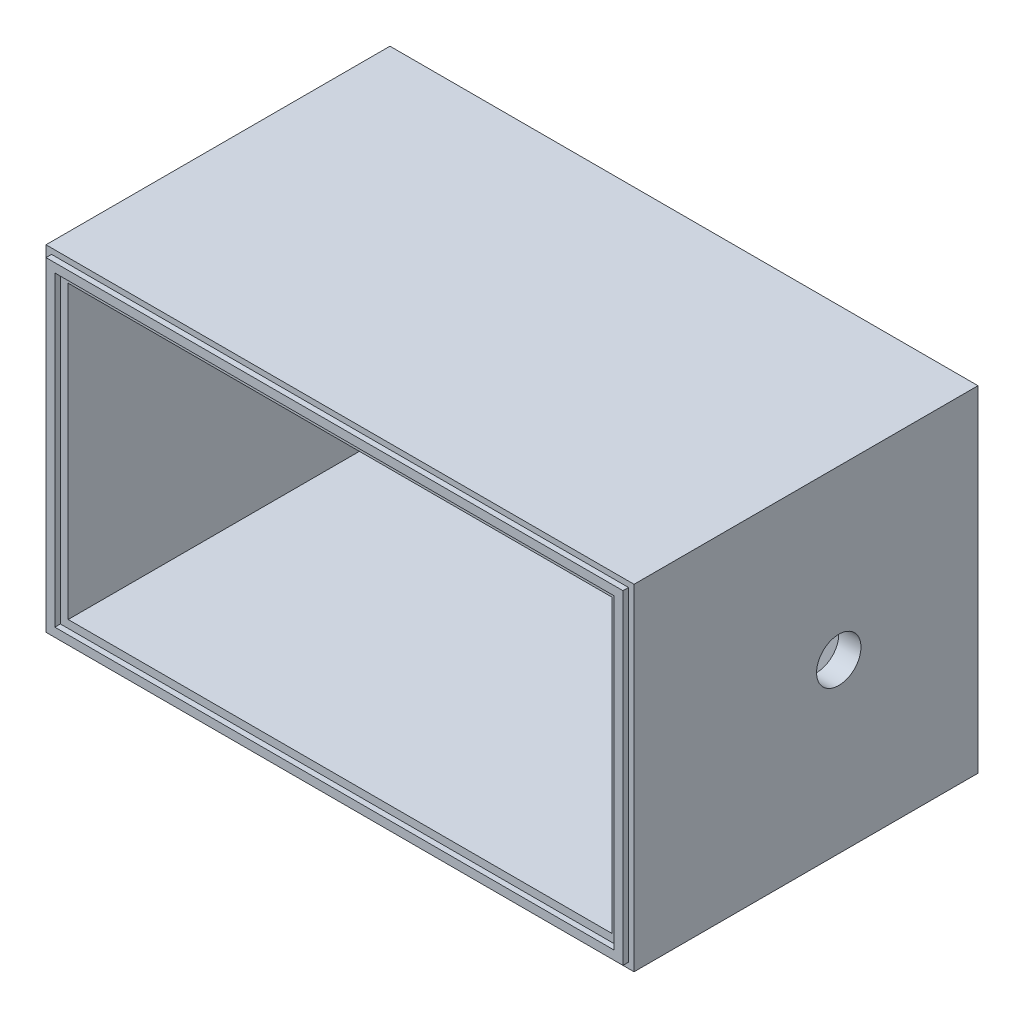
ISO-10303-21;
HEADER;
FILE_DESCRIPTION(('STEP AP214'),'2;1');
FILE_NAME('part.step','',(''),(''),'','','');
FILE_SCHEMA(('AUTOMOTIVE_DESIGN { 1 0 10303 214 1 1 1 1 }'));
ENDSEC;
DATA;
#1=APPLICATION_CONTEXT('core data for automotive mechanical design processes');
#2=APPLICATION_PROTOCOL_DEFINITION('international standard','automotive_design',2000,#1);
#3=PRODUCT_CONTEXT('',#1,'mechanical');
#4=PRODUCT('Part','Part','',(#3));
#5=PRODUCT_RELATED_PRODUCT_CATEGORY('part','',(#4));
#6=PRODUCT_DEFINITION_FORMATION('','',#4);
#7=PRODUCT_DEFINITION_CONTEXT('part definition',#1,'design');
#8=PRODUCT_DEFINITION('design','',#6,#7);
#9=PRODUCT_DEFINITION_SHAPE('','',#8);
#10=(LENGTH_UNIT() NAMED_UNIT(*) SI_UNIT(.MILLI.,.METRE.));
#11=(NAMED_UNIT(*) PLANE_ANGLE_UNIT() SI_UNIT($,.RADIAN.));
#12=(NAMED_UNIT(*) SI_UNIT($,.STERADIAN.) SOLID_ANGLE_UNIT());
#13=UNCERTAINTY_MEASURE_WITH_UNIT(LENGTH_MEASURE(1.E-05),#10,'distance_accuracy_value','');
#14=(GEOMETRIC_REPRESENTATION_CONTEXT(3) GLOBAL_UNCERTAINTY_ASSIGNED_CONTEXT((#13)) GLOBAL_UNIT_ASSIGNED_CONTEXT((#10,
#11,#12)) REPRESENTATION_CONTEXT('',''));
#15=CARTESIAN_POINT('',(0.,0.,0.));
#16=DIRECTION('',(0.,0.,1.));
#17=DIRECTION('',(1.,0.,0.));
#18=AXIS2_PLACEMENT_3D('',#15,#16,#17);
#19=CARTESIAN_POINT('',(-22.65,11.275,27.001));
#20=DIRECTION('',(0.,0.,-1.));
#21=DIRECTION('',(-1.,0.,0.));
#22=AXIS2_PLACEMENT_3D('',#19,#20,#21);
#23=CYLINDRICAL_SURFACE('',#22,1.);
#24=CARTESIAN_POINT('',(-22.65,11.275,-1.2));
#25=DIRECTION('',(0.,0.,1.));
#26=DIRECTION('',(1.,0.,0.));
#27=AXIS2_PLACEMENT_3D('',#24,#25,#26);
#28=CIRCLE('',#27,1.);
#29=CARTESIAN_POINT('',(-21.65,11.275,-1.2));
#30=VERTEX_POINT('',#29);
#31=EDGE_CURVE('E215',#30,#30,#28,.T.);
#32=ORIENTED_EDGE('',*,*,#31,.T.);
#33=EDGE_LOOP('',(#32));
#34=FACE_BOUND('',#33,.T.);
#35=CARTESIAN_POINT('',(-22.65,11.275,-3.));
#36=DIRECTION('',(0.,0.,-1.));
#37=DIRECTION('',(-1.,0.,0.));
#38=AXIS2_PLACEMENT_3D('',#35,#36,#37);
#39=CIRCLE('',#38,1.);
#40=CARTESIAN_POINT('',(-23.65,11.275,-3.));
#41=VERTEX_POINT('',#40);
#42=EDGE_CURVE('E40',#41,#41,#39,.T.);
#43=ORIENTED_EDGE('',*,*,#42,.T.);
#44=EDGE_LOOP('',(#43));
#45=FACE_BOUND('',#44,.T.);
#46=ADVANCED_FACE('F36',(#34,#45),#23,.F.);
#47=CARTESIAN_POINT('',(-22.65,-11.275,27.001));
#48=DIRECTION('',(0.,0.,-1.));
#49=DIRECTION('',(-1.,0.,0.));
#50=AXIS2_PLACEMENT_3D('',#47,#48,#49);
#51=CYLINDRICAL_SURFACE('',#50,1.);
#52=CARTESIAN_POINT('',(-22.65,-11.275,-1.2));
#53=DIRECTION('',(0.,0.,1.));
#54=DIRECTION('',(1.,0.,0.));
#55=AXIS2_PLACEMENT_3D('',#52,#53,#54);
#56=CIRCLE('',#55,1.);
#57=CARTESIAN_POINT('',(-21.65,-11.275,-1.2));
#58=VERTEX_POINT('',#57);
#59=EDGE_CURVE('E225',#58,#58,#56,.F.);
#60=ORIENTED_EDGE('',*,*,#59,.F.);
#61=EDGE_LOOP('',(#60));
#62=FACE_BOUND('',#61,.T.);
#63=CARTESIAN_POINT('',(-22.65,-11.275,-3.));
#64=DIRECTION('',(0.,0.,-1.));
#65=DIRECTION('',(-1.,0.,0.));
#66=AXIS2_PLACEMENT_3D('',#63,#64,#65);
#67=CIRCLE('',#66,1.);
#68=CARTESIAN_POINT('',(-23.65,-11.275,-3.));
#69=VERTEX_POINT('',#68);
#70=EDGE_CURVE('E222',#69,#69,#67,.F.);
#71=ORIENTED_EDGE('',*,*,#70,.F.);
#72=EDGE_LOOP('',(#71));
#73=FACE_BOUND('',#72,.T.);
#74=ADVANCED_FACE('F335',(#62,#73),#51,.F.);
#75=CARTESIAN_POINT('',(22.65,-11.275,27.001));
#76=DIRECTION('',(0.,0.,-1.));
#77=DIRECTION('',(-1.,0.,0.));
#78=AXIS2_PLACEMENT_3D('',#75,#76,#77);
#79=CYLINDRICAL_SURFACE('',#78,1.);
#80=CARTESIAN_POINT('',(22.65,-11.275,-1.2));
#81=DIRECTION('',(0.,0.,1.));
#82=DIRECTION('',(1.,0.,0.));
#83=AXIS2_PLACEMENT_3D('',#80,#81,#82);
#84=CIRCLE('',#83,1.);
#85=CARTESIAN_POINT('',(23.65,-11.275,-1.2));
#86=VERTEX_POINT('',#85);
#87=EDGE_CURVE('E235',#86,#86,#84,.T.);
#88=ORIENTED_EDGE('',*,*,#87,.T.);
#89=EDGE_LOOP('',(#88));
#90=FACE_BOUND('',#89,.T.);
#91=CARTESIAN_POINT('',(22.65,-11.275,-3.));
#92=DIRECTION('',(0.,0.,-1.));
#93=DIRECTION('',(-1.,0.,0.));
#94=AXIS2_PLACEMENT_3D('',#91,#92,#93);
#95=CIRCLE('',#94,1.);
#96=CARTESIAN_POINT('',(21.65,-11.275,-3.));
#97=VERTEX_POINT('',#96);
#98=EDGE_CURVE('E232',#97,#97,#95,.T.);
#99=ORIENTED_EDGE('',*,*,#98,.T.);
#100=EDGE_LOOP('',(#99));
#101=FACE_BOUND('',#100,.T.);
#102=ADVANCED_FACE('F337',(#90,#101),#79,.F.);
#103=CARTESIAN_POINT('',(22.65,11.275,27.001));
#104=DIRECTION('',(0.,0.,-1.));
#105=DIRECTION('',(-1.,0.,0.));
#106=AXIS2_PLACEMENT_3D('',#103,#104,#105);
#107=CYLINDRICAL_SURFACE('',#106,1.);
#108=CARTESIAN_POINT('',(22.65,11.275,-1.2));
#109=DIRECTION('',(0.,0.,1.));
#110=DIRECTION('',(1.,0.,0.));
#111=AXIS2_PLACEMENT_3D('',#108,#109,#110);
#112=CIRCLE('',#111,1.);
#113=CARTESIAN_POINT('',(23.65,11.275,-1.2));
#114=VERTEX_POINT('',#113);
#115=EDGE_CURVE('E245',#114,#114,#112,.F.);
#116=ORIENTED_EDGE('',*,*,#115,.F.);
#117=EDGE_LOOP('',(#116));
#118=FACE_BOUND('',#117,.T.);
#119=CARTESIAN_POINT('',(22.65,11.275,-3.));
#120=DIRECTION('',(0.,0.,-1.));
#121=DIRECTION('',(-1.,0.,0.));
#122=AXIS2_PLACEMENT_3D('',#119,#120,#121);
#123=CIRCLE('',#122,1.);
#124=CARTESIAN_POINT('',(21.65,11.275,-3.));
#125=VERTEX_POINT('',#124);
#126=EDGE_CURVE('E242',#125,#125,#123,.F.);
#127=ORIENTED_EDGE('',*,*,#126,.F.);
#128=EDGE_LOOP('',(#127));
#129=FACE_BOUND('',#128,.T.);
#130=ADVANCED_FACE('F344',(#118,#129),#107,.F.);
#131=CARTESIAN_POINT('',(26.5,15.125,-4.));
#132=DIRECTION('',(1.,0.,0.));
#133=DIRECTION('',(0.,1.,0.));
#134=AXIS2_PLACEMENT_3D('',#131,#132,#133);
#135=PLANE('',#134);
#136=CARTESIAN_POINT('',(26.5,0.,8.54820426973959));
#137=DIRECTION('',(-1.,0.,0.));
#138=DIRECTION('',(0.,0.,1.));
#139=AXIS2_PLACEMENT_3D('',#136,#137,#138);
#140=CIRCLE('',#139,2.);
#141=CARTESIAN_POINT('',(26.5,0.,10.5482042697396));
#142=VERTEX_POINT('',#141);
#143=EDGE_CURVE('E204',#142,#142,#140,.T.);
#144=ORIENTED_EDGE('',*,*,#143,.T.);
#145=EDGE_LOOP('',(#144));
#146=FACE_BOUND('',#145,.T.);
#147=DIRECTION('',(0.,0.,1.));
#148=VECTOR('',#147,1.);
#149=CARTESIAN_POINT('',(26.5,15.125,-4.));
#150=LINE('',#149,#148);
#151=CARTESIAN_POINT('',(26.5,15.125,-4.));
#152=VERTEX_POINT('',#151);
#153=CARTESIAN_POINT('',(26.5,15.125,27.));
#154=VERTEX_POINT('',#153);
#155=EDGE_CURVE('E321',#152,#154,#150,.T.);
#156=ORIENTED_EDGE('',*,*,#155,.T.);
#157=DIRECTION('',(0.,1.,0.));
#158=VECTOR('',#157,1.);
#159=CARTESIAN_POINT('',(26.5,15.125,27.));
#160=LINE('',#159,#158);
#161=CARTESIAN_POINT('',(26.5,-15.125,27.));
#162=VERTEX_POINT('',#161);
#163=EDGE_CURVE('E292',#162,#154,#160,.T.);
#164=ORIENTED_EDGE('',*,*,#163,.F.);
#165=DIRECTION('',(0.,0.,1.));
#166=VECTOR('',#165,1.);
#167=CARTESIAN_POINT('',(26.5,-15.125,-4.));
#168=LINE('',#167,#166);
#169=CARTESIAN_POINT('',(26.5,-15.125,-4.));
#170=VERTEX_POINT('',#169);
#171=EDGE_CURVE('E11',#170,#162,#168,.T.);
#172=ORIENTED_EDGE('',*,*,#171,.F.);
#173=DIRECTION('',(0.,1.,0.));
#174=VECTOR('',#173,1.);
#175=CARTESIAN_POINT('',(26.5,15.125,-4.));
#176=LINE('',#175,#174);
#177=EDGE_CURVE('E310',#170,#152,#176,.T.);
#178=ORIENTED_EDGE('',*,*,#177,.T.);
#179=EDGE_LOOP('',(#156,#164,#172,#178));
#180=FACE_BOUND('',#179,.T.);
#181=ADVANCED_FACE('F38',(#146,#180),#135,.T.);
#182=CARTESIAN_POINT('',(-26.5,-15.125,-4.));
#183=DIRECTION('',(0.,-1.,0.));
#184=DIRECTION('',(0.,0.,-1.));
#185=AXIS2_PLACEMENT_3D('',#182,#183,#184);
#186=PLANE('',#185);
#187=ORIENTED_EDGE('',*,*,#171,.T.);
#188=DIRECTION('',(1.,0.,0.));
#189=VECTOR('',#188,1.);
#190=CARTESIAN_POINT('',(-26.5,-15.125,27.));
#191=LINE('',#190,#189);
#192=CARTESIAN_POINT('',(-26.5,-15.125,27.));
#193=VERTEX_POINT('',#192);
#194=EDGE_CURVE('E307',#193,#162,#191,.T.);
#195=ORIENTED_EDGE('',*,*,#194,.F.);
#196=DIRECTION('',(0.,0.,1.));
#197=VECTOR('',#196,1.);
#198=CARTESIAN_POINT('',(-26.5,-15.125,-4.));
#199=LINE('',#198,#197);
#200=CARTESIAN_POINT('',(-26.5,-15.125,-4.));
#201=VERTEX_POINT('',#200);
#202=EDGE_CURVE('E45',#201,#193,#199,.T.);
#203=ORIENTED_EDGE('',*,*,#202,.F.);
#204=DIRECTION('',(1.,0.,0.));
#205=VECTOR('',#204,1.);
#206=CARTESIAN_POINT('',(-26.5,-15.125,-4.));
#207=LINE('',#206,#205);
#208=EDGE_CURVE('E319',#201,#170,#207,.T.);
#209=ORIENTED_EDGE('',*,*,#208,.T.);
#210=EDGE_LOOP('',(#187,#195,#203,#209));
#211=FACE_BOUND('',#210,.T.);
#212=ADVANCED_FACE('F402',(#211),#186,.T.);
#213=CARTESIAN_POINT('',(-26.5,15.125,-4.));
#214=DIRECTION('',(-1.,0.,0.));
#215=DIRECTION('',(0.,-1.,0.));
#216=AXIS2_PLACEMENT_3D('',#213,#214,#215);
#217=PLANE('',#216);
#218=ORIENTED_EDGE('',*,*,#202,.T.);
#219=DIRECTION('',(0.,-1.,0.));
#220=VECTOR('',#219,1.);
#221=CARTESIAN_POINT('',(-26.5,15.125,27.));
#222=LINE('',#221,#220);
#223=CARTESIAN_POINT('',(-26.5,15.125,27.));
#224=VERTEX_POINT('',#223);
#225=EDGE_CURVE('E304',#224,#193,#222,.T.);
#226=ORIENTED_EDGE('',*,*,#225,.F.);
#227=DIRECTION('',(0.,0.,1.));
#228=VECTOR('',#227,1.);
#229=CARTESIAN_POINT('',(-26.5,15.125,-4.));
#230=LINE('',#229,#228);
#231=CARTESIAN_POINT('',(-26.5,15.125,-4.));
#232=VERTEX_POINT('',#231);
#233=EDGE_CURVE('E324',#232,#224,#230,.T.);
#234=ORIENTED_EDGE('',*,*,#233,.F.);
#235=DIRECTION('',(0.,-1.,0.));
#236=VECTOR('',#235,1.);
#237=CARTESIAN_POINT('',(-26.5,15.125,-4.));
#238=LINE('',#237,#236);
#239=EDGE_CURVE('E316',#232,#201,#238,.T.);
#240=ORIENTED_EDGE('',*,*,#239,.T.);
#241=EDGE_LOOP('',(#218,#226,#234,#240));
#242=FACE_BOUND('',#241,.T.);
#243=ADVANCED_FACE('F405',(#242),#217,.T.);
#244=CARTESIAN_POINT('',(-26.5,15.125,-4.));
#245=DIRECTION('',(0.,1.,0.));
#246=DIRECTION('',(0.,0.,1.));
#247=AXIS2_PLACEMENT_3D('',#244,#245,#246);
#248=PLANE('',#247);
#249=ORIENTED_EDGE('',*,*,#233,.T.);
#250=DIRECTION('',(-1.,0.,0.));
#251=VECTOR('',#250,1.);
#252=CARTESIAN_POINT('',(-26.5,15.125,27.));
#253=LINE('',#252,#251);
#254=EDGE_CURVE('E301',#154,#224,#253,.T.);
#255=ORIENTED_EDGE('',*,*,#254,.F.);
#256=ORIENTED_EDGE('',*,*,#155,.F.);
#257=DIRECTION('',(-1.,0.,0.));
#258=VECTOR('',#257,1.);
#259=CARTESIAN_POINT('',(-26.5,15.125,-4.));
#260=LINE('',#259,#258);
#261=EDGE_CURVE('E313',#152,#232,#260,.T.);
#262=ORIENTED_EDGE('',*,*,#261,.T.);
#263=EDGE_LOOP('',(#249,#255,#256,#262));
#264=FACE_BOUND('',#263,.T.);
#265=ADVANCED_FACE('F400',(#264),#248,.T.);
#266=CARTESIAN_POINT('',(0.,0.,-4.));
#267=DIRECTION('',(0.,0.,1.));
#268=DIRECTION('',(1.,0.,0.));
#269=AXIS2_PLACEMENT_3D('',#266,#267,#268);
#270=PLANE('',#269);
#271=CARTESIAN_POINT('',(-22.65,11.275,-4.));
#272=DIRECTION('',(0.,0.,1.));
#273=DIRECTION('',(1.,0.,0.));
#274=AXIS2_PLACEMENT_3D('',#271,#272,#273);
#275=CIRCLE('',#274,1.55);
#276=CARTESIAN_POINT('',(-21.1,11.275,-4.));
#277=VERTEX_POINT('',#276);
#278=EDGE_CURVE('E207',#277,#277,#275,.T.);
#279=ORIENTED_EDGE('',*,*,#278,.T.);
#280=EDGE_LOOP('',(#279));
#281=FACE_BOUND('',#280,.T.);
#282=CARTESIAN_POINT('',(-22.65,-11.275,-4.));
#283=DIRECTION('',(0.,0.,-1.));
#284=DIRECTION('',(1.,0.,0.));
#285=AXIS2_PLACEMENT_3D('',#282,#283,#284);
#286=CIRCLE('',#285,1.55);
#287=CARTESIAN_POINT('',(-21.1,-11.275,-4.));
#288=VERTEX_POINT('',#287);
#289=EDGE_CURVE('E218',#288,#288,#286,.T.);
#290=ORIENTED_EDGE('',*,*,#289,.F.);
#291=EDGE_LOOP('',(#290));
#292=FACE_BOUND('',#291,.T.);
#293=CARTESIAN_POINT('',(22.65,-11.275,-4.));
#294=DIRECTION('',(0.,0.,1.));
#295=DIRECTION('',(-1.,0.,0.));
#296=AXIS2_PLACEMENT_3D('',#293,#294,#295);
#297=CIRCLE('',#296,1.55);
#298=CARTESIAN_POINT('',(21.1,-11.275,-4.));
#299=VERTEX_POINT('',#298);
#300=EDGE_CURVE('E228',#299,#299,#297,.T.);
#301=ORIENTED_EDGE('',*,*,#300,.T.);
#302=EDGE_LOOP('',(#301));
#303=FACE_BOUND('',#302,.T.);
#304=CARTESIAN_POINT('',(22.65,11.275,-4.));
#305=DIRECTION('',(0.,0.,-1.));
#306=DIRECTION('',(-1.,0.,0.));
#307=AXIS2_PLACEMENT_3D('',#304,#305,#306);
#308=CIRCLE('',#307,1.55);
#309=CARTESIAN_POINT('',(21.1,11.275,-4.));
#310=VERTEX_POINT('',#309);
#311=EDGE_CURVE('E238',#310,#310,#308,.T.);
#312=ORIENTED_EDGE('',*,*,#311,.F.);
#313=EDGE_LOOP('',(#312));
#314=FACE_BOUND('',#313,.T.);
#315=ORIENTED_EDGE('',*,*,#177,.F.);
#316=ORIENTED_EDGE('',*,*,#208,.F.);
#317=ORIENTED_EDGE('',*,*,#239,.F.);
#318=ORIENTED_EDGE('',*,*,#261,.F.);
#319=EDGE_LOOP('',(#315,#316,#317,#318));
#320=FACE_BOUND('',#319,.T.);
#321=ADVANCED_FACE('F397',(#281,#292,#303,#314,#320),#270,.F.);
#322=CARTESIAN_POINT('',(0.,0.,27.));
#323=DIRECTION('',(0.,0.,1.));
#324=DIRECTION('',(1.,0.,0.));
#325=AXIS2_PLACEMENT_3D('',#322,#323,#324);
#326=PLANE('',#325);
#327=DIRECTION('',(0.,1.,0.));
#328=VECTOR('',#327,1.);
#329=CARTESIAN_POINT('',(26.,14.625,27.));
#330=LINE('',#329,#328);
#331=CARTESIAN_POINT('',(26.,-14.625,27.));
#332=VERTEX_POINT('',#331);
#333=CARTESIAN_POINT('',(26.,14.625,27.));
#334=VERTEX_POINT('',#333);
#335=EDGE_CURVE('E257',#332,#334,#330,.T.);
#336=ORIENTED_EDGE('',*,*,#335,.F.);
#337=DIRECTION('',(1.,0.,0.));
#338=VECTOR('',#337,1.);
#339=CARTESIAN_POINT('',(-26.,-14.625,27.));
#340=LINE('',#339,#338);
#341=CARTESIAN_POINT('',(-26.,-14.625,27.));
#342=VERTEX_POINT('',#341);
#343=EDGE_CURVE('E263',#342,#332,#340,.T.);
#344=ORIENTED_EDGE('',*,*,#343,.F.);
#345=DIRECTION('',(0.,-1.,0.));
#346=VECTOR('',#345,1.);
#347=CARTESIAN_POINT('',(-26.,14.625,27.));
#348=LINE('',#347,#346);
#349=CARTESIAN_POINT('',(-26.,14.625,27.));
#350=VERTEX_POINT('',#349);
#351=EDGE_CURVE('E260',#350,#342,#348,.T.);
#352=ORIENTED_EDGE('',*,*,#351,.F.);
#353=DIRECTION('',(-1.,0.,0.));
#354=VECTOR('',#353,1.);
#355=CARTESIAN_POINT('',(-26.,14.625,27.));
#356=LINE('',#355,#354);
#357=EDGE_CURVE('E53',#334,#350,#356,.T.);
#358=ORIENTED_EDGE('',*,*,#357,.F.);
#359=EDGE_LOOP('',(#336,#344,#352,#358));
#360=FACE_BOUND('',#359,.T.);
#361=ORIENTED_EDGE('',*,*,#163,.T.);
#362=ORIENTED_EDGE('',*,*,#254,.T.);
#363=ORIENTED_EDGE('',*,*,#225,.T.);
#364=ORIENTED_EDGE('',*,*,#194,.T.);
#365=EDGE_LOOP('',(#361,#362,#363,#364));
#366=FACE_BOUND('',#365,.T.);
#367=ADVANCED_FACE('F378',(#360,#366),#326,.T.);
#368=CARTESIAN_POINT('',(0.,0.,-1.2));
#369=DIRECTION('',(0.,0.,1.));
#370=DIRECTION('',(1.,0.,0.));
#371=AXIS2_PLACEMENT_3D('',#368,#369,#370);
#372=PLANE('',#371);
#373=ORIENTED_EDGE('',*,*,#31,.F.);
#374=EDGE_LOOP('',(#373));
#375=FACE_BOUND('',#374,.T.);
#376=ORIENTED_EDGE('',*,*,#59,.T.);
#377=EDGE_LOOP('',(#376));
#378=FACE_BOUND('',#377,.T.);
#379=ORIENTED_EDGE('',*,*,#87,.F.);
#380=EDGE_LOOP('',(#379));
#381=FACE_BOUND('',#380,.T.);
#382=ORIENTED_EDGE('',*,*,#115,.T.);
#383=EDGE_LOOP('',(#382));
#384=FACE_BOUND('',#383,.T.);
#385=DIRECTION('',(0.,1.,0.));
#386=VECTOR('',#385,1.);
#387=CARTESIAN_POINT('',(24.5,13.125,-1.2));
#388=LINE('',#387,#386);
#389=CARTESIAN_POINT('',(24.5,-13.125,-1.2));
#390=VERTEX_POINT('',#389);
#391=CARTESIAN_POINT('',(24.5,13.125,-1.2));
#392=VERTEX_POINT('',#391);
#393=EDGE_CURVE('E267',#390,#392,#388,.T.);
#394=ORIENTED_EDGE('',*,*,#393,.T.);
#395=DIRECTION('',(-1.,0.,0.));
#396=VECTOR('',#395,1.);
#397=CARTESIAN_POINT('',(-24.5,13.125,-1.2));
#398=LINE('',#397,#396);
#399=CARTESIAN_POINT('',(-24.5,13.125,-1.2));
#400=VERTEX_POINT('',#399);
#401=EDGE_CURVE('E270',#392,#400,#398,.T.);
#402=ORIENTED_EDGE('',*,*,#401,.T.);
#403=DIRECTION('',(0.,-1.,0.));
#404=VECTOR('',#403,1.);
#405=CARTESIAN_POINT('',(-24.5,13.125,-1.2));
#406=LINE('',#405,#404);
#407=CARTESIAN_POINT('',(-24.5,-13.125,-1.2));
#408=VERTEX_POINT('',#407);
#409=EDGE_CURVE('E274',#400,#408,#406,.T.);
#410=ORIENTED_EDGE('',*,*,#409,.T.);
#411=DIRECTION('',(1.,0.,0.));
#412=VECTOR('',#411,1.);
#413=CARTESIAN_POINT('',(-24.5,-13.125,-1.2));
#414=LINE('',#413,#412);
#415=EDGE_CURVE('E277',#408,#390,#414,.T.);
#416=ORIENTED_EDGE('',*,*,#415,.T.);
#417=EDGE_LOOP('',(#394,#402,#410,#416));
#418=FACE_BOUND('',#417,.T.);
#419=ADVANCED_FACE('F374',(#375,#378,#381,#384,#418),#372,.T.);
#420=CARTESIAN_POINT('',(-24.5,13.125,-1.2));
#421=DIRECTION('',(0.,1.,0.));
#422=DIRECTION('',(0.,0.,1.));
#423=AXIS2_PLACEMENT_3D('',#420,#421,#422);
#424=PLANE('',#423);
#425=DIRECTION('',(-1.,0.,0.));
#426=VECTOR('',#425,1.);
#427=CARTESIAN_POINT('',(-24.5,13.125,27.));
#428=LINE('',#427,#426);
#429=CARTESIAN_POINT('',(24.5,13.125,27.));
#430=VERTEX_POINT('',#429);
#431=CARTESIAN_POINT('',(-24.5,13.125,27.));
#432=VERTEX_POINT('',#431);
#433=EDGE_CURVE('E282',#430,#432,#428,.T.);
#434=ORIENTED_EDGE('',*,*,#433,.T.);
#435=DIRECTION('',(0.,0.,1.));
#436=VECTOR('',#435,1.);
#437=CARTESIAN_POINT('',(-24.5,13.125,-1.2));
#438=LINE('',#437,#436);
#439=EDGE_CURVE('E295',#400,#432,#438,.T.);
#440=ORIENTED_EDGE('',*,*,#439,.F.);
#441=ORIENTED_EDGE('',*,*,#401,.F.);
#442=DIRECTION('',(0.,0.,1.));
#443=VECTOR('',#442,1.);
#444=CARTESIAN_POINT('',(24.5,13.125,-1.2));
#445=LINE('',#444,#443);
#446=EDGE_CURVE('E280',#392,#430,#445,.T.);
#447=ORIENTED_EDGE('',*,*,#446,.T.);
#448=EDGE_LOOP('',(#434,#440,#441,#447));
#449=FACE_BOUND('',#448,.T.);
#450=ADVANCED_FACE('F377',(#449),#424,.F.);
#451=CARTESIAN_POINT('',(-24.5,13.125,-1.2));
#452=DIRECTION('',(-1.,0.,0.));
#453=DIRECTION('',(0.,0.,1.));
#454=AXIS2_PLACEMENT_3D('',#451,#452,#453);
#455=PLANE('',#454);
#456=DIRECTION('',(0.,-1.,0.));
#457=VECTOR('',#456,1.);
#458=CARTESIAN_POINT('',(-24.5,13.125,27.));
#459=LINE('',#458,#457);
#460=CARTESIAN_POINT('',(-24.5,-13.125,27.));
#461=VERTEX_POINT('',#460);
#462=EDGE_CURVE('E285',#432,#461,#459,.T.);
#463=ORIENTED_EDGE('',*,*,#462,.T.);
#464=DIRECTION('',(0.,0.,1.));
#465=VECTOR('',#464,1.);
#466=CARTESIAN_POINT('',(-24.5,-13.125,-1.2));
#467=LINE('',#466,#465);
#468=EDGE_CURVE('E293',#408,#461,#467,.T.);
#469=ORIENTED_EDGE('',*,*,#468,.F.);
#470=ORIENTED_EDGE('',*,*,#409,.F.);
#471=ORIENTED_EDGE('',*,*,#439,.T.);
#472=EDGE_LOOP('',(#463,#469,#470,#471));
#473=FACE_BOUND('',#472,.T.);
#474=ADVANCED_FACE('F384',(#473),#455,.F.);
#475=CARTESIAN_POINT('',(-24.5,-13.125,-1.2));
#476=DIRECTION('',(0.,-1.,0.));
#477=DIRECTION('',(0.,0.,-1.));
#478=AXIS2_PLACEMENT_3D('',#475,#476,#477);
#479=PLANE('',#478);
#480=DIRECTION('',(1.,0.,0.));
#481=VECTOR('',#480,1.);
#482=CARTESIAN_POINT('',(-24.5,-13.125,27.));
#483=LINE('',#482,#481);
#484=CARTESIAN_POINT('',(24.5,-13.125,27.));
#485=VERTEX_POINT('',#484);
#486=EDGE_CURVE('E271',#461,#485,#483,.T.);
#487=ORIENTED_EDGE('',*,*,#486,.T.);
#488=DIRECTION('',(0.,0.,1.));
#489=VECTOR('',#488,1.);
#490=CARTESIAN_POINT('',(24.5,-13.125,-1.2));
#491=LINE('',#490,#489);
#492=EDGE_CURVE('E290',#390,#485,#491,.T.);
#493=ORIENTED_EDGE('',*,*,#492,.F.);
#494=ORIENTED_EDGE('',*,*,#415,.F.);
#495=ORIENTED_EDGE('',*,*,#468,.T.);
#496=EDGE_LOOP('',(#487,#493,#494,#495));
#497=FACE_BOUND('',#496,.T.);
#498=ADVANCED_FACE('F380',(#497),#479,.F.);
#499=CARTESIAN_POINT('',(24.5,13.125,-1.2));
#500=DIRECTION('',(1.,0.,0.));
#501=DIRECTION('',(0.,0.,-1.));
#502=AXIS2_PLACEMENT_3D('',#499,#500,#501);
#503=PLANE('',#502);
#504=CARTESIAN_POINT('',(24.5,0.,8.54820426973959));
#505=DIRECTION('',(-1.,0.,0.));
#506=DIRECTION('',(0.,0.,1.));
#507=AXIS2_PLACEMENT_3D('',#504,#505,#506);
#508=CIRCLE('',#507,2.);
#509=CARTESIAN_POINT('',(24.5,0.,10.5482042697396));
#510=VERTEX_POINT('',#509);
#511=EDGE_CURVE('E203',#510,#510,#508,.T.);
#512=ORIENTED_EDGE('',*,*,#511,.F.);
#513=EDGE_LOOP('',(#512));
#514=FACE_BOUND('',#513,.T.);
#515=DIRECTION('',(0.,1.,0.));
#516=VECTOR('',#515,1.);
#517=CARTESIAN_POINT('',(24.5,13.125,27.));
#518=LINE('',#517,#516);
#519=EDGE_CURVE('E266',#485,#430,#518,.T.);
#520=ORIENTED_EDGE('',*,*,#519,.T.);
#521=ORIENTED_EDGE('',*,*,#446,.F.);
#522=ORIENTED_EDGE('',*,*,#393,.F.);
#523=ORIENTED_EDGE('',*,*,#492,.T.);
#524=EDGE_LOOP('',(#520,#521,#522,#523));
#525=FACE_BOUND('',#524,.T.);
#526=ADVANCED_FACE('F383',(#514,#525),#503,.F.);
#527=ORIENTED_EDGE('',*,*,#519,.F.);
#528=ORIENTED_EDGE('',*,*,#486,.F.);
#529=ORIENTED_EDGE('',*,*,#462,.F.);
#530=ORIENTED_EDGE('',*,*,#433,.F.);
#531=EDGE_LOOP('',(#527,#528,#529,#530));
#532=FACE_BOUND('',#531,.T.);
#533=DIRECTION('',(-1.,0.,0.));
#534=VECTOR('',#533,1.);
#535=CARTESIAN_POINT('',(-25.2,13.825,27.));
#536=LINE('',#535,#534);
#537=CARTESIAN_POINT('',(25.2,13.825,27.));
#538=VERTEX_POINT('',#537);
#539=CARTESIAN_POINT('',(-25.2,13.825,27.));
#540=VERTEX_POINT('',#539);
#541=EDGE_CURVE('E165',#538,#540,#536,.T.);
#542=ORIENTED_EDGE('',*,*,#541,.T.);
#543=DIRECTION('',(0.,-1.,0.));
#544=VECTOR('',#543,1.);
#545=CARTESIAN_POINT('',(-25.2,13.825,27.));
#546=LINE('',#545,#544);
#547=CARTESIAN_POINT('',(-25.2,-13.825,27.));
#548=VERTEX_POINT('',#547);
#549=EDGE_CURVE('E248',#540,#548,#546,.T.);
#550=ORIENTED_EDGE('',*,*,#549,.T.);
#551=DIRECTION('',(1.,0.,0.));
#552=VECTOR('',#551,1.);
#553=CARTESIAN_POINT('',(-25.2,-13.825,27.));
#554=LINE('',#553,#552);
#555=CARTESIAN_POINT('',(25.2,-13.825,27.));
#556=VERTEX_POINT('',#555);
#557=EDGE_CURVE('E251',#548,#556,#554,.T.);
#558=ORIENTED_EDGE('',*,*,#557,.T.);
#559=DIRECTION('',(0.,1.,0.));
#560=VECTOR('',#559,1.);
#561=CARTESIAN_POINT('',(25.2,13.825,27.));
#562=LINE('',#561,#560);
#563=EDGE_CURVE('E254',#556,#538,#562,.T.);
#564=ORIENTED_EDGE('',*,*,#563,.T.);
#565=EDGE_LOOP('',(#542,#550,#558,#564));
#566=FACE_BOUND('',#565,.T.);
#567=ADVANCED_FACE('F366',(#532,#566),#326,.T.);
#568=CARTESIAN_POINT('',(22.65,11.275,-3.));
#569=DIRECTION('',(0.,0.,-1.));
#570=DIRECTION('',(-1.,0.,0.));
#571=AXIS2_PLACEMENT_3D('',#568,#569,#570);
#572=PLANE('',#571);
#573=CARTESIAN_POINT('',(22.65,11.275,-3.));
#574=DIRECTION('',(0.,0.,-1.));
#575=DIRECTION('',(-1.,0.,0.));
#576=AXIS2_PLACEMENT_3D('',#573,#574,#575);
#577=CIRCLE('',#576,1.55);
#578=CARTESIAN_POINT('',(21.1,11.275,-3.));
#579=VERTEX_POINT('',#578);
#580=EDGE_CURVE('E239',#579,#579,#577,.T.);
#581=ORIENTED_EDGE('',*,*,#580,.T.);
#582=EDGE_LOOP('',(#581));
#583=FACE_BOUND('',#582,.T.);
#584=ORIENTED_EDGE('',*,*,#126,.T.);
#585=EDGE_LOOP('',(#584));
#586=FACE_BOUND('',#585,.T.);
#587=ADVANCED_FACE('F363',(#583,#586),#572,.T.);
#588=CARTESIAN_POINT('',(22.65,11.275,-3.));
#589=DIRECTION('',(0.,0.,-1.));
#590=DIRECTION('',(-1.,0.,0.));
#591=AXIS2_PLACEMENT_3D('',#588,#589,#590);
#592=CYLINDRICAL_SURFACE('',#591,1.55);
#593=ORIENTED_EDGE('',*,*,#580,.F.);
#594=EDGE_LOOP('',(#593));
#595=FACE_BOUND('',#594,.T.);
#596=ORIENTED_EDGE('',*,*,#311,.T.);
#597=EDGE_LOOP('',(#596));
#598=FACE_BOUND('',#597,.T.);
#599=ADVANCED_FACE('F360',(#595,#598),#592,.F.);
#600=CARTESIAN_POINT('',(22.65,-11.275,-3.));
#601=DIRECTION('',(0.,0.,-1.));
#602=DIRECTION('',(-1.,0.,0.));
#603=AXIS2_PLACEMENT_3D('',#600,#601,#602);
#604=CYLINDRICAL_SURFACE('',#603,1.55);
#605=CARTESIAN_POINT('',(22.65,-11.275,-3.));
#606=DIRECTION('',(0.,0.,1.));
#607=DIRECTION('',(-1.,0.,0.));
#608=AXIS2_PLACEMENT_3D('',#605,#606,#607);
#609=CIRCLE('',#608,1.55);
#610=CARTESIAN_POINT('',(21.1,-11.275,-3.));
#611=VERTEX_POINT('',#610);
#612=EDGE_CURVE('E229',#611,#611,#609,.T.);
#613=ORIENTED_EDGE('',*,*,#612,.T.);
#614=EDGE_LOOP('',(#613));
#615=FACE_BOUND('',#614,.T.);
#616=ORIENTED_EDGE('',*,*,#300,.F.);
#617=EDGE_LOOP('',(#616));
#618=FACE_BOUND('',#617,.T.);
#619=ADVANCED_FACE('F357',(#615,#618),#604,.F.);
#620=CARTESIAN_POINT('',(22.65,-11.275,-3.));
#621=DIRECTION('',(0.,0.,-1.));
#622=DIRECTION('',(-1.,0.,0.));
#623=AXIS2_PLACEMENT_3D('',#620,#621,#622);
#624=PLANE('',#623);
#625=ORIENTED_EDGE('',*,*,#98,.F.);
#626=EDGE_LOOP('',(#625));
#627=FACE_BOUND('',#626,.T.);
#628=ORIENTED_EDGE('',*,*,#612,.F.);
#629=EDGE_LOOP('',(#628));
#630=FACE_BOUND('',#629,.T.);
#631=ADVANCED_FACE('F354',(#627,#630),#624,.T.);
#632=CARTESIAN_POINT('',(-22.65,-11.275,-3.));
#633=DIRECTION('',(0.,0.,-1.));
#634=DIRECTION('',(1.,0.,0.));
#635=AXIS2_PLACEMENT_3D('',#632,#633,#634);
#636=PLANE('',#635);
#637=CARTESIAN_POINT('',(-22.65,-11.275,-3.));
#638=DIRECTION('',(0.,0.,-1.));
#639=DIRECTION('',(1.,0.,0.));
#640=AXIS2_PLACEMENT_3D('',#637,#638,#639);
#641=CIRCLE('',#640,1.55);
#642=CARTESIAN_POINT('',(-21.1,-11.275,-3.));
#643=VERTEX_POINT('',#642);
#644=EDGE_CURVE('E219',#643,#643,#641,.T.);
#645=ORIENTED_EDGE('',*,*,#644,.T.);
#646=EDGE_LOOP('',(#645));
#647=FACE_BOUND('',#646,.T.);
#648=ORIENTED_EDGE('',*,*,#70,.T.);
#649=EDGE_LOOP('',(#648));
#650=FACE_BOUND('',#649,.T.);
#651=ADVANCED_FACE('F333',(#647,#650),#636,.T.);
#652=CARTESIAN_POINT('',(-22.65,-11.275,-3.));
#653=DIRECTION('',(0.,0.,-1.));
#654=DIRECTION('',(-1.,0.,0.));
#655=AXIS2_PLACEMENT_3D('',#652,#653,#654);
#656=CYLINDRICAL_SURFACE('',#655,1.55);
#657=ORIENTED_EDGE('',*,*,#644,.F.);
#658=EDGE_LOOP('',(#657));
#659=FACE_BOUND('',#658,.T.);
#660=ORIENTED_EDGE('',*,*,#289,.T.);
#661=EDGE_LOOP('',(#660));
#662=FACE_BOUND('',#661,.T.);
#663=ADVANCED_FACE('F352',(#659,#662),#656,.F.);
#664=CARTESIAN_POINT('',(-22.65,11.275,-3.));
#665=DIRECTION('',(0.,0.,-1.));
#666=DIRECTION('',(-1.,0.,0.));
#667=AXIS2_PLACEMENT_3D('',#664,#665,#666);
#668=CYLINDRICAL_SURFACE('',#667,1.55);
#669=CARTESIAN_POINT('',(-22.65,11.275,-3.));
#670=DIRECTION('',(0.,0.,1.));
#671=DIRECTION('',(1.,0.,0.));
#672=AXIS2_PLACEMENT_3D('',#669,#670,#671);
#673=CIRCLE('',#672,1.55);
#674=CARTESIAN_POINT('',(-21.1,11.275,-3.));
#675=VERTEX_POINT('',#674);
#676=EDGE_CURVE('E210',#675,#675,#673,.T.);
#677=ORIENTED_EDGE('',*,*,#676,.T.);
#678=EDGE_LOOP('',(#677));
#679=FACE_BOUND('',#678,.T.);
#680=ORIENTED_EDGE('',*,*,#278,.F.);
#681=EDGE_LOOP('',(#680));
#682=FACE_BOUND('',#681,.T.);
#683=ADVANCED_FACE('F484',(#679,#682),#668,.F.);
#684=CARTESIAN_POINT('',(-22.65,11.275,-3.));
#685=DIRECTION('',(0.,0.,-1.));
#686=DIRECTION('',(1.,0.,0.));
#687=AXIS2_PLACEMENT_3D('',#684,#685,#686);
#688=PLANE('',#687);
#689=ORIENTED_EDGE('',*,*,#42,.F.);
#690=EDGE_LOOP('',(#689));
#691=FACE_BOUND('',#690,.T.);
#692=ORIENTED_EDGE('',*,*,#676,.F.);
#693=EDGE_LOOP('',(#692));
#694=FACE_BOUND('',#693,.T.);
#695=ADVANCED_FACE('F433',(#691,#694),#688,.T.);
#696=CARTESIAN_POINT('',(26.5,0.,8.54820426973959));
#697=DIRECTION('',(-1.,0.,0.));
#698=DIRECTION('',(0.,0.,1.));
#699=AXIS2_PLACEMENT_3D('',#696,#697,#698);
#700=CYLINDRICAL_SURFACE('',#699,2.);
#701=ORIENTED_EDGE('',*,*,#143,.F.);
#702=EDGE_LOOP('',(#701));
#703=FACE_BOUND('',#702,.T.);
#704=ORIENTED_EDGE('',*,*,#511,.T.);
#705=EDGE_LOOP('',(#704));
#706=FACE_BOUND('',#705,.T.);
#707=ADVANCED_FACE('F430',(#703,#706),#700,.F.);
#708=CARTESIAN_POINT('',(0.,0.,27.5));
#709=DIRECTION('',(0.,0.,1.));
#710=DIRECTION('',(1.,0.,0.));
#711=AXIS2_PLACEMENT_3D('',#708,#709,#710);
#712=PLANE('',#711);
#713=DIRECTION('',(1.,0.,0.));
#714=VECTOR('',#713,1.);
#715=CARTESIAN_POINT('',(-26.,-14.625,27.5));
#716=LINE('',#715,#714);
#717=CARTESIAN_POINT('',(-26.,-14.625,27.5));
#718=VERTEX_POINT('',#717);
#719=CARTESIAN_POINT('',(26.,-14.625,27.5));
#720=VERTEX_POINT('',#719);
#721=EDGE_CURVE('E166',#718,#720,#716,.T.);
#722=ORIENTED_EDGE('',*,*,#721,.T.);
#723=DIRECTION('',(0.,1.,0.));
#724=VECTOR('',#723,1.);
#725=CARTESIAN_POINT('',(26.,-14.625,27.5));
#726=LINE('',#725,#724);
#727=CARTESIAN_POINT('',(26.,14.625,27.5));
#728=VERTEX_POINT('',#727);
#729=EDGE_CURVE('E185',#720,#728,#726,.T.);
#730=ORIENTED_EDGE('',*,*,#729,.T.);
#731=DIRECTION('',(-1.,0.,0.));
#732=VECTOR('',#731,1.);
#733=CARTESIAN_POINT('',(26.,14.625,27.5));
#734=LINE('',#733,#732);
#735=CARTESIAN_POINT('',(-26.,14.625,27.5));
#736=VERTEX_POINT('',#735);
#737=EDGE_CURVE('E187',#728,#736,#734,.T.);
#738=ORIENTED_EDGE('',*,*,#737,.T.);
#739=DIRECTION('',(0.,-1.,0.));
#740=VECTOR('',#739,1.);
#741=CARTESIAN_POINT('',(-26.,14.625,27.5));
#742=LINE('',#741,#740);
#743=EDGE_CURVE('E189',#736,#718,#742,.T.);
#744=ORIENTED_EDGE('',*,*,#743,.T.);
#745=EDGE_LOOP('',(#722,#730,#738,#744));
#746=FACE_BOUND('',#745,.T.);
#747=DIRECTION('',(-1.,0.,0.));
#748=VECTOR('',#747,1.);
#749=CARTESIAN_POINT('',(25.2,13.825,27.5));
#750=LINE('',#749,#748);
#751=CARTESIAN_POINT('',(25.2,13.825,27.5));
#752=VERTEX_POINT('',#751);
#753=CARTESIAN_POINT('',(-25.2,13.825,27.5));
#754=VERTEX_POINT('',#753);
#755=EDGE_CURVE('E158',#752,#754,#750,.T.);
#756=ORIENTED_EDGE('',*,*,#755,.F.);
#757=DIRECTION('',(0.,1.,0.));
#758=VECTOR('',#757,1.);
#759=CARTESIAN_POINT('',(25.2,-13.825,27.5));
#760=LINE('',#759,#758);
#761=CARTESIAN_POINT('',(25.2,-13.825,27.5));
#762=VERTEX_POINT('',#761);
#763=EDGE_CURVE('E150',#762,#752,#760,.T.);
#764=ORIENTED_EDGE('',*,*,#763,.F.);
#765=DIRECTION('',(1.,0.,0.));
#766=VECTOR('',#765,1.);
#767=CARTESIAN_POINT('',(-25.2,-13.825,27.5));
#768=LINE('',#767,#766);
#769=CARTESIAN_POINT('',(-25.2,-13.825,27.5));
#770=VERTEX_POINT('',#769);
#771=EDGE_CURVE('E174',#770,#762,#768,.T.);
#772=ORIENTED_EDGE('',*,*,#771,.F.);
#773=DIRECTION('',(0.,-1.,0.));
#774=VECTOR('',#773,1.);
#775=CARTESIAN_POINT('',(-25.2,13.825,27.5));
#776=LINE('',#775,#774);
#777=EDGE_CURVE('E172',#754,#770,#776,.T.);
#778=ORIENTED_EDGE('',*,*,#777,.F.);
#779=EDGE_LOOP('',(#756,#764,#772,#778));
#780=FACE_BOUND('',#779,.T.);
#781=ADVANCED_FACE('F170',(#746,#780),#712,.T.);
#782=CARTESIAN_POINT('',(-26.,-14.625,27.5));
#783=DIRECTION('',(0.,1.,0.));
#784=DIRECTION('',(0.,0.,1.));
#785=AXIS2_PLACEMENT_3D('',#782,#783,#784);
#786=PLANE('',#785);
#787=ORIENTED_EDGE('',*,*,#343,.T.);
#788=DIRECTION('',(0.,0.,-1.));
#789=VECTOR('',#788,1.);
#790=CARTESIAN_POINT('',(26.,-14.625,27.5));
#791=LINE('',#790,#789);
#792=EDGE_CURVE('E200',#720,#332,#791,.T.);
#793=ORIENTED_EDGE('',*,*,#792,.F.);
#794=ORIENTED_EDGE('',*,*,#721,.F.);
#795=DIRECTION('',(0.,0.,-1.));
#796=VECTOR('',#795,1.);
#797=CARTESIAN_POINT('',(-26.,-14.625,27.5));
#798=LINE('',#797,#796);
#799=EDGE_CURVE('E191',#718,#342,#798,.T.);
#800=ORIENTED_EDGE('',*,*,#799,.T.);
#801=EDGE_LOOP('',(#787,#793,#794,#800));
#802=FACE_BOUND('',#801,.T.);
#803=ADVANCED_FACE('F466',(#802),#786,.F.);
#804=CARTESIAN_POINT('',(26.,-14.625,27.5));
#805=DIRECTION('',(-1.,0.,0.));
#806=DIRECTION('',(0.,0.,1.));
#807=AXIS2_PLACEMENT_3D('',#804,#805,#806);
#808=PLANE('',#807);
#809=ORIENTED_EDGE('',*,*,#335,.T.);
#810=DIRECTION('',(0.,0.,-1.));
#811=VECTOR('',#810,1.);
#812=CARTESIAN_POINT('',(26.,14.625,27.5));
#813=LINE('',#812,#811);
#814=EDGE_CURVE('E197',#728,#334,#813,.T.);
#815=ORIENTED_EDGE('',*,*,#814,.F.);
#816=ORIENTED_EDGE('',*,*,#729,.F.);
#817=ORIENTED_EDGE('',*,*,#792,.T.);
#818=EDGE_LOOP('',(#809,#815,#816,#817));
#819=FACE_BOUND('',#818,.T.);
#820=ADVANCED_FACE('F474',(#819),#808,.F.);
#821=CARTESIAN_POINT('',(26.,14.625,27.5));
#822=DIRECTION('',(0.,-1.,0.));
#823=DIRECTION('',(0.,0.,-1.));
#824=AXIS2_PLACEMENT_3D('',#821,#822,#823);
#825=PLANE('',#824);
#826=ORIENTED_EDGE('',*,*,#357,.T.);
#827=DIRECTION('',(0.,0.,-1.));
#828=VECTOR('',#827,1.);
#829=CARTESIAN_POINT('',(-26.,14.625,27.5));
#830=LINE('',#829,#828);
#831=EDGE_CURVE('E194',#736,#350,#830,.T.);
#832=ORIENTED_EDGE('',*,*,#831,.F.);
#833=ORIENTED_EDGE('',*,*,#737,.F.);
#834=ORIENTED_EDGE('',*,*,#814,.T.);
#835=EDGE_LOOP('',(#826,#832,#833,#834));
#836=FACE_BOUND('',#835,.T.);
#837=ADVANCED_FACE('F470',(#836),#825,.F.);
#838=CARTESIAN_POINT('',(-26.,14.625,27.5));
#839=DIRECTION('',(1.,0.,0.));
#840=DIRECTION('',(0.,0.,-1.));
#841=AXIS2_PLACEMENT_3D('',#838,#839,#840);
#842=PLANE('',#841);
#843=ORIENTED_EDGE('',*,*,#351,.T.);
#844=ORIENTED_EDGE('',*,*,#799,.F.);
#845=ORIENTED_EDGE('',*,*,#743,.F.);
#846=ORIENTED_EDGE('',*,*,#831,.T.);
#847=EDGE_LOOP('',(#843,#844,#845,#846));
#848=FACE_BOUND('',#847,.T.);
#849=ADVANCED_FACE('F463',(#848),#842,.F.);
#850=CARTESIAN_POINT('',(25.2,-13.825,27.5));
#851=DIRECTION('',(-1.,0.,0.));
#852=DIRECTION('',(0.,-1.,0.));
#853=AXIS2_PLACEMENT_3D('',#850,#851,#852);
#854=PLANE('',#853);
#855=DIRECTION('',(0.,0.,-1.));
#856=VECTOR('',#855,1.);
#857=CARTESIAN_POINT('',(25.2,13.825,27.5));
#858=LINE('',#857,#856);
#859=EDGE_CURVE('E153',#752,#538,#858,.T.);
#860=ORIENTED_EDGE('',*,*,#859,.T.);
#861=ORIENTED_EDGE('',*,*,#563,.F.);
#862=DIRECTION('',(0.,0.,-1.));
#863=VECTOR('',#862,1.);
#864=CARTESIAN_POINT('',(25.2,-13.825,27.5));
#865=LINE('',#864,#863);
#866=EDGE_CURVE('E61',#762,#556,#865,.T.);
#867=ORIENTED_EDGE('',*,*,#866,.F.);
#868=ORIENTED_EDGE('',*,*,#763,.T.);
#869=EDGE_LOOP('',(#860,#861,#867,#868));
#870=FACE_BOUND('',#869,.T.);
#871=ADVANCED_FACE('F152',(#870),#854,.T.);
#872=CARTESIAN_POINT('',(25.2,13.825,27.5));
#873=DIRECTION('',(0.,-1.,0.));
#874=DIRECTION('',(0.,0.,-1.));
#875=AXIS2_PLACEMENT_3D('',#872,#873,#874);
#876=PLANE('',#875);
#877=DIRECTION('',(0.,0.,-1.));
#878=VECTOR('',#877,1.);
#879=CARTESIAN_POINT('',(-25.2,13.825,27.5));
#880=LINE('',#879,#878);
#881=EDGE_CURVE('E167',#754,#540,#880,.T.);
#882=ORIENTED_EDGE('',*,*,#881,.T.);
#883=ORIENTED_EDGE('',*,*,#541,.F.);
#884=ORIENTED_EDGE('',*,*,#859,.F.);
#885=ORIENTED_EDGE('',*,*,#755,.T.);
#886=EDGE_LOOP('',(#882,#883,#884,#885));
#887=FACE_BOUND('',#886,.T.);
#888=ADVANCED_FACE('F162',(#887),#876,.T.);
#889=CARTESIAN_POINT('',(-25.2,13.825,27.5));
#890=DIRECTION('',(1.,0.,0.));
#891=DIRECTION('',(0.,1.,0.));
#892=AXIS2_PLACEMENT_3D('',#889,#890,#891);
#893=PLANE('',#892);
#894=DIRECTION('',(0.,0.,-1.));
#895=VECTOR('',#894,1.);
#896=CARTESIAN_POINT('',(-25.2,-13.825,27.5));
#897=LINE('',#896,#895);
#898=EDGE_CURVE('E179',#770,#548,#897,.T.);
#899=ORIENTED_EDGE('',*,*,#898,.T.);
#900=ORIENTED_EDGE('',*,*,#549,.F.);
#901=ORIENTED_EDGE('',*,*,#881,.F.);
#902=ORIENTED_EDGE('',*,*,#777,.T.);
#903=EDGE_LOOP('',(#899,#900,#901,#902));
#904=FACE_BOUND('',#903,.T.);
#905=ADVANCED_FACE('F451',(#904),#893,.T.);
#906=CARTESIAN_POINT('',(-25.2,-13.825,27.5));
#907=DIRECTION('',(0.,1.,0.));
#908=DIRECTION('',(0.,0.,1.));
#909=AXIS2_PLACEMENT_3D('',#906,#907,#908);
#910=PLANE('',#909);
#911=ORIENTED_EDGE('',*,*,#866,.T.);
#912=ORIENTED_EDGE('',*,*,#557,.F.);
#913=ORIENTED_EDGE('',*,*,#898,.F.);
#914=ORIENTED_EDGE('',*,*,#771,.T.);
#915=EDGE_LOOP('',(#911,#912,#913,#914));
#916=FACE_BOUND('',#915,.T.);
#917=ADVANCED_FACE('F449',(#916),#910,.T.);
#918=CLOSED_SHELL('',(#46,#74,#102,#130,#181,#212,#243,#265,#321,#367,#419,#450,#474,#498,#526,
#567,#587,#599,#619,#631,#651,#663,#683,#695,#707,#781,#803,#820,#837,#849,#871,#888,#905,#917));
#919=MANIFOLD_SOLID_BREP('B2',#918);
#920=ADVANCED_BREP_SHAPE_REPRESENTATION('',(#18,#919),#14);
#921=SHAPE_DEFINITION_REPRESENTATION(#9,#920);
ENDSEC;
END-ISO-10303-21;
